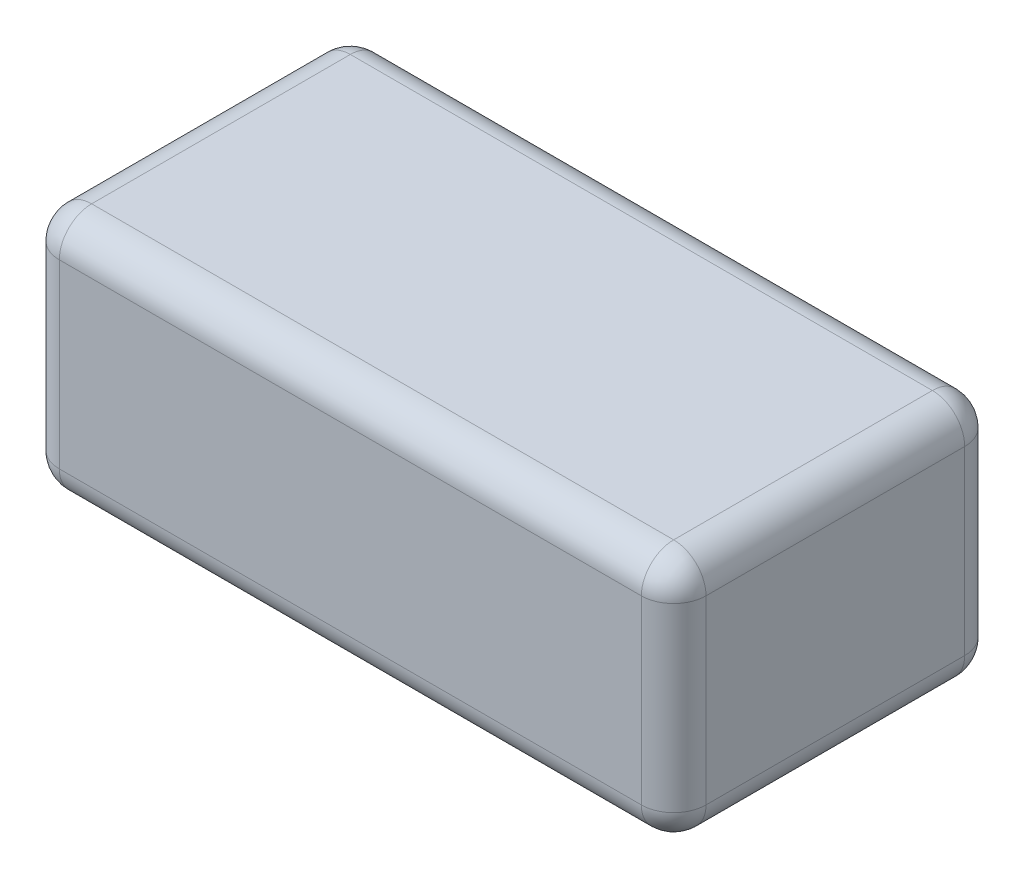
ISO-10303-21;
HEADER;
FILE_DESCRIPTION(('STEP AP214'),'2;1');
FILE_NAME('part.step','',(''),(''),'','','');
FILE_SCHEMA(('AUTOMOTIVE_DESIGN { 1 0 10303 214 1 1 1 1 }'));
ENDSEC;
DATA;
#1=APPLICATION_CONTEXT('core data for automotive mechanical design processes');
#2=APPLICATION_PROTOCOL_DEFINITION('international standard','automotive_design',2000,#1);
#3=PRODUCT_CONTEXT('',#1,'mechanical');
#4=PRODUCT('Part','Part','',(#3));
#5=PRODUCT_RELATED_PRODUCT_CATEGORY('part','',(#4));
#6=PRODUCT_DEFINITION_FORMATION('','',#4);
#7=PRODUCT_DEFINITION_CONTEXT('part definition',#1,'design');
#8=PRODUCT_DEFINITION('design','',#6,#7);
#9=PRODUCT_DEFINITION_SHAPE('','',#8);
#10=(LENGTH_UNIT() NAMED_UNIT(*) SI_UNIT(.MILLI.,.METRE.));
#11=(NAMED_UNIT(*) PLANE_ANGLE_UNIT() SI_UNIT($,.RADIAN.));
#12=(NAMED_UNIT(*) SI_UNIT($,.STERADIAN.) SOLID_ANGLE_UNIT());
#13=UNCERTAINTY_MEASURE_WITH_UNIT(LENGTH_MEASURE(1.E-05),#10,'distance_accuracy_value','');
#14=(GEOMETRIC_REPRESENTATION_CONTEXT(3) GLOBAL_UNCERTAINTY_ASSIGNED_CONTEXT((#13)) GLOBAL_UNIT_ASSIGNED_CONTEXT((#10,
#11,#12)) REPRESENTATION_CONTEXT('',''));
#15=CARTESIAN_POINT('',(0.,0.,0.));
#16=DIRECTION('',(0.,0.,1.));
#17=DIRECTION('',(1.,0.,0.));
#18=AXIS2_PLACEMENT_3D('',#15,#16,#17);
#19=CARTESIAN_POINT('',(0.45,0.05,0.2));
#20=DIRECTION('',(1.,0.,0.));
#21=DIRECTION('',(0.,0.,-1.));
#22=AXIS2_PLACEMENT_3D('',#19,#20,#21);
#23=SPHERICAL_SURFACE('',#22,0.05);
#24=CARTESIAN_POINT('',(0.45,0.05,0.2));
#25=DIRECTION('',(-1.,0.,0.));
#26=DIRECTION('',(0.,0.,1.));
#27=AXIS2_PLACEMENT_3D('',#24,#25,#26);
#28=CIRCLE('',#27,0.05);
#29=CARTESIAN_POINT('',(0.45,0.,0.2));
#30=VERTEX_POINT('',#29);
#31=CARTESIAN_POINT('',(0.45,0.050000000000024,0.25));
#32=VERTEX_POINT('',#31);
#33=EDGE_CURVE('E110',#30,#32,#28,.T.);
#34=ORIENTED_EDGE('',*,*,#33,.F.);
#35=CARTESIAN_POINT('',(0.45,0.05,0.2));
#36=DIRECTION('',(0.,0.,1.));
#37=DIRECTION('',(1.,0.,0.));
#38=AXIS2_PLACEMENT_3D('',#35,#36,#37);
#39=CIRCLE('',#38,0.05);
#40=CARTESIAN_POINT('',(0.5,0.05,0.2));
#41=VERTEX_POINT('',#40);
#42=EDGE_CURVE('E121',#41,#30,#39,.F.);
#43=ORIENTED_EDGE('',*,*,#42,.F.);
#44=CARTESIAN_POINT('',(0.45,0.05,0.2));
#45=DIRECTION('',(0.,-1.,0.));
#46=DIRECTION('',(0.,0.,-1.));
#47=AXIS2_PLACEMENT_3D('',#44,#45,#46);
#48=CIRCLE('',#47,0.05);
#49=EDGE_CURVE('E130',#32,#41,#48,.F.);
#50=ORIENTED_EDGE('',*,*,#49,.F.);
#51=EDGE_LOOP('',(#34,#43,#50));
#52=FACE_BOUND('',#51,.T.);
#53=ADVANCED_FACE('F16',(#52),#23,.T.);
#54=CARTESIAN_POINT('',(-0.45,0.05,0.2));
#55=DIRECTION('',(1.,0.,0.));
#56=DIRECTION('',(0.,0.,-1.));
#57=AXIS2_PLACEMENT_3D('',#54,#55,#56);
#58=SPHERICAL_SURFACE('',#57,0.05);
#59=CARTESIAN_POINT('',(-0.45,0.05,0.2));
#60=DIRECTION('',(0.,-1.,0.));
#61=DIRECTION('',(0.,0.,-1.));
#62=AXIS2_PLACEMENT_3D('',#59,#60,#61);
#63=CIRCLE('',#62,0.05);
#64=CARTESIAN_POINT('',(-0.5,0.05,0.2));
#65=VERTEX_POINT('',#64);
#66=CARTESIAN_POINT('',(-0.45,0.05,0.25));
#67=VERTEX_POINT('',#66);
#68=EDGE_CURVE('E260',#65,#67,#63,.F.);
#69=ORIENTED_EDGE('',*,*,#68,.F.);
#70=CARTESIAN_POINT('',(-0.45,0.05,0.2));
#71=DIRECTION('',(0.,0.,-1.));
#72=DIRECTION('',(-1.,0.,0.));
#73=AXIS2_PLACEMENT_3D('',#70,#71,#72);
#74=CIRCLE('',#73,0.05);
#75=CARTESIAN_POINT('',(-0.45,0.,0.199999999999976));
#76=VERTEX_POINT('',#75);
#77=EDGE_CURVE('E269',#76,#65,#74,.T.);
#78=ORIENTED_EDGE('',*,*,#77,.F.);
#79=CARTESIAN_POINT('',(-0.45,0.05,0.2));
#80=DIRECTION('',(-1.,0.,0.));
#81=DIRECTION('',(0.,0.,1.));
#82=AXIS2_PLACEMENT_3D('',#79,#80,#81);
#83=CIRCLE('',#82,0.05);
#84=EDGE_CURVE('E113',#67,#76,#83,.F.);
#85=ORIENTED_EDGE('',*,*,#84,.F.);
#86=EDGE_LOOP('',(#69,#78,#85));
#87=FACE_BOUND('',#86,.T.);
#88=ADVANCED_FACE('F150',(#87),#58,.T.);
#89=CARTESIAN_POINT('',(-0.45,0.05,-0.2));
#90=DIRECTION('',(1.,0.,0.));
#91=DIRECTION('',(0.,0.,-1.));
#92=AXIS2_PLACEMENT_3D('',#89,#90,#91);
#93=SPHERICAL_SURFACE('',#92,0.05);
#94=CARTESIAN_POINT('',(-0.45,0.05,-0.2));
#95=DIRECTION('',(0.,-1.,0.));
#96=DIRECTION('',(0.,0.,-1.));
#97=AXIS2_PLACEMENT_3D('',#94,#95,#96);
#98=CIRCLE('',#97,0.05);
#99=CARTESIAN_POINT('',(-0.45,0.05,-0.25));
#100=VERTEX_POINT('',#99);
#101=CARTESIAN_POINT('',(-0.5,0.05,-0.2));
#102=VERTEX_POINT('',#101);
#103=EDGE_CURVE('E255',#100,#102,#98,.F.);
#104=ORIENTED_EDGE('',*,*,#103,.F.);
#105=CARTESIAN_POINT('',(-0.45,0.05,-0.2));
#106=DIRECTION('',(1.,0.,0.));
#107=DIRECTION('',(0.,0.,-1.));
#108=AXIS2_PLACEMENT_3D('',#105,#106,#107);
#109=CIRCLE('',#108,0.05);
#110=CARTESIAN_POINT('',(-0.45,0.,-0.2));
#111=VERTEX_POINT('',#110);
#112=EDGE_CURVE('E252',#111,#100,#109,.T.);
#113=ORIENTED_EDGE('',*,*,#112,.F.);
#114=CARTESIAN_POINT('',(-0.45,0.05,-0.2));
#115=DIRECTION('',(0.,0.,-1.));
#116=DIRECTION('',(-1.,0.,0.));
#117=AXIS2_PLACEMENT_3D('',#114,#115,#116);
#118=CIRCLE('',#117,0.05);
#119=EDGE_CURVE('E266',#102,#111,#118,.F.);
#120=ORIENTED_EDGE('',*,*,#119,.F.);
#121=EDGE_LOOP('',(#104,#113,#120));
#122=FACE_BOUND('',#121,.T.);
#123=ADVANCED_FACE('F146',(#122),#93,.T.);
#124=CARTESIAN_POINT('',(0.45,0.05,-0.2));
#125=DIRECTION('',(1.,0.,0.));
#126=DIRECTION('',(0.,0.,-1.));
#127=AXIS2_PLACEMENT_3D('',#124,#125,#126);
#128=SPHERICAL_SURFACE('',#127,0.05);
#129=CARTESIAN_POINT('',(0.45,0.05,-0.2));
#130=DIRECTION('',(1.,0.,0.));
#131=DIRECTION('',(0.,0.,-1.));
#132=AXIS2_PLACEMENT_3D('',#129,#130,#131);
#133=CIRCLE('',#132,0.05);
#134=CARTESIAN_POINT('',(0.45,0.05,-0.25));
#135=VERTEX_POINT('',#134);
#136=CARTESIAN_POINT('',(0.45,0.,-0.199999999999988));
#137=VERTEX_POINT('',#136);
#138=EDGE_CURVE('E250',#135,#137,#133,.F.);
#139=ORIENTED_EDGE('',*,*,#138,.F.);
#140=CARTESIAN_POINT('',(0.45,0.05,-0.2));
#141=DIRECTION('',(0.,-1.,0.));
#142=DIRECTION('',(0.,0.,-1.));
#143=AXIS2_PLACEMENT_3D('',#140,#141,#142);
#144=CIRCLE('',#143,0.05);
#145=CARTESIAN_POINT('',(0.5,0.05,-0.2));
#146=VERTEX_POINT('',#145);
#147=EDGE_CURVE('E257',#146,#135,#144,.F.);
#148=ORIENTED_EDGE('',*,*,#147,.F.);
#149=CARTESIAN_POINT('',(0.45,0.05,-0.2));
#150=DIRECTION('',(0.,0.,1.));
#151=DIRECTION('',(1.,0.,0.));
#152=AXIS2_PLACEMENT_3D('',#149,#150,#151);
#153=CIRCLE('',#152,0.05);
#154=EDGE_CURVE('E132',#137,#146,#153,.T.);
#155=ORIENTED_EDGE('',*,*,#154,.F.);
#156=EDGE_LOOP('',(#139,#148,#155));
#157=FACE_BOUND('',#156,.T.);
#158=ADVANCED_FACE('F142',(#157),#128,.T.);
#159=CARTESIAN_POINT('',(0.45,0.05,0.25));
#160=DIRECTION('',(0.,0.,1.));
#161=DIRECTION('',(1.,0.,0.));
#162=AXIS2_PLACEMENT_3D('',#159,#160,#161);
#163=CYLINDRICAL_SURFACE('',#162,0.05);
#164=ORIENTED_EDGE('',*,*,#154,.T.);
#165=DIRECTION('',(0.,0.,1.));
#166=VECTOR('',#165,1.);
#167=CARTESIAN_POINT('',(0.5,0.05,0.25));
#168=LINE('',#167,#166);
#169=EDGE_CURVE('E126',#146,#41,#168,.T.);
#170=ORIENTED_EDGE('',*,*,#169,.T.);
#171=ORIENTED_EDGE('',*,*,#42,.T.);
#172=DIRECTION('',(0.,0.,1.));
#173=VECTOR('',#172,1.);
#174=CARTESIAN_POINT('',(0.45,0.,0.25));
#175=LINE('',#174,#173);
#176=EDGE_CURVE('E123',#30,#137,#175,.F.);
#177=ORIENTED_EDGE('',*,*,#176,.T.);
#178=EDGE_LOOP('',(#164,#170,#171,#177));
#179=FACE_BOUND('',#178,.T.);
#180=ADVANCED_FACE('F122',(#179),#163,.T.);
#181=CARTESIAN_POINT('',(0.45,0.38,0.2));
#182=DIRECTION('',(0.,-1.,0.));
#183=DIRECTION('',(0.,0.,-1.));
#184=AXIS2_PLACEMENT_3D('',#181,#182,#183);
#185=CYLINDRICAL_SURFACE('',#184,0.05);
#186=ORIENTED_EDGE('',*,*,#49,.T.);
#187=DIRECTION('',(0.,1.,0.));
#188=VECTOR('',#187,1.);
#189=CARTESIAN_POINT('',(0.5,0.38,0.2));
#190=LINE('',#189,#188);
#191=CARTESIAN_POINT('',(0.5,0.33,0.2));
#192=VERTEX_POINT('',#191);
#193=EDGE_CURVE('E246',#41,#192,#190,.T.);
#194=ORIENTED_EDGE('',*,*,#193,.T.);
#195=CARTESIAN_POINT('',(0.45,0.33,0.2));
#196=DIRECTION('',(0.,-1.,0.));
#197=DIRECTION('',(1.,0.,0.));
#198=AXIS2_PLACEMENT_3D('',#195,#196,#197);
#199=CIRCLE('',#198,0.05);
#200=CARTESIAN_POINT('',(0.45,0.33,0.25));
#201=VERTEX_POINT('',#200);
#202=EDGE_CURVE('E241',#201,#192,#199,.F.);
#203=ORIENTED_EDGE('',*,*,#202,.F.);
#204=DIRECTION('',(0.,1.,0.));
#205=VECTOR('',#204,1.);
#206=CARTESIAN_POINT('',(0.45,0.38,0.25));
#207=LINE('',#206,#205);
#208=EDGE_CURVE('E115',#201,#32,#207,.F.);
#209=ORIENTED_EDGE('',*,*,#208,.T.);
#210=EDGE_LOOP('',(#186,#194,#203,#209));
#211=FACE_BOUND('',#210,.T.);
#212=ADVANCED_FACE('F273',(#211),#185,.T.);
#213=CARTESIAN_POINT('',(-0.45,0.05,0.25));
#214=DIRECTION('',(0.,0.,-1.));
#215=DIRECTION('',(-1.,0.,0.));
#216=AXIS2_PLACEMENT_3D('',#213,#214,#215);
#217=CYLINDRICAL_SURFACE('',#216,0.05);
#218=ORIENTED_EDGE('',*,*,#119,.T.);
#219=DIRECTION('',(0.,0.,-1.));
#220=VECTOR('',#219,1.);
#221=CARTESIAN_POINT('',(-0.45,0.,0.25));
#222=LINE('',#221,#220);
#223=EDGE_CURVE('E263',#111,#76,#222,.F.);
#224=ORIENTED_EDGE('',*,*,#223,.T.);
#225=ORIENTED_EDGE('',*,*,#77,.T.);
#226=DIRECTION('',(0.,0.,-1.));
#227=VECTOR('',#226,1.);
#228=CARTESIAN_POINT('',(-0.5,0.05,0.25));
#229=LINE('',#228,#227);
#230=EDGE_CURVE('E219',#65,#102,#229,.T.);
#231=ORIENTED_EDGE('',*,*,#230,.T.);
#232=EDGE_LOOP('',(#218,#224,#225,#231));
#233=FACE_BOUND('',#232,.T.);
#234=ADVANCED_FACE('F360',(#233),#217,.T.);
#235=CARTESIAN_POINT('',(-0.45,0.38,0.2));
#236=DIRECTION('',(0.,-1.,0.));
#237=DIRECTION('',(0.,0.,-1.));
#238=AXIS2_PLACEMENT_3D('',#235,#236,#237);
#239=CYLINDRICAL_SURFACE('',#238,0.05);
#240=ORIENTED_EDGE('',*,*,#68,.T.);
#241=DIRECTION('',(0.,1.,0.));
#242=VECTOR('',#241,1.);
#243=CARTESIAN_POINT('',(-0.45,0.38,0.25));
#244=LINE('',#243,#242);
#245=CARTESIAN_POINT('',(-0.45,0.33,0.25));
#246=VERTEX_POINT('',#245);
#247=EDGE_CURVE('E240',#67,#246,#244,.T.);
#248=ORIENTED_EDGE('',*,*,#247,.T.);
#249=CARTESIAN_POINT('',(-0.45,0.33,0.2));
#250=DIRECTION('',(0.,-1.,0.));
#251=DIRECTION('',(1.,0.,0.));
#252=AXIS2_PLACEMENT_3D('',#249,#250,#251);
#253=CIRCLE('',#252,0.05);
#254=CARTESIAN_POINT('',(-0.5,0.33,0.2));
#255=VERTEX_POINT('',#254);
#256=EDGE_CURVE('E222',#255,#246,#253,.F.);
#257=ORIENTED_EDGE('',*,*,#256,.F.);
#258=DIRECTION('',(0.,1.,0.));
#259=VECTOR('',#258,1.);
#260=CARTESIAN_POINT('',(-0.5,0.38,0.2));
#261=LINE('',#260,#259);
#262=EDGE_CURVE('E213',#255,#65,#261,.F.);
#263=ORIENTED_EDGE('',*,*,#262,.T.);
#264=EDGE_LOOP('',(#240,#248,#257,#263));
#265=FACE_BOUND('',#264,.T.);
#266=ADVANCED_FACE('F358',(#265),#239,.T.);
#267=CARTESIAN_POINT('',(0.45,0.38,-0.2));
#268=DIRECTION('',(0.,-1.,0.));
#269=DIRECTION('',(0.,0.,-1.));
#270=AXIS2_PLACEMENT_3D('',#267,#268,#269);
#271=CYLINDRICAL_SURFACE('',#270,0.05);
#272=ORIENTED_EDGE('',*,*,#147,.T.);
#273=DIRECTION('',(0.,1.,0.));
#274=VECTOR('',#273,1.);
#275=CARTESIAN_POINT('',(0.45,0.38,-0.25));
#276=LINE('',#275,#274);
#277=CARTESIAN_POINT('',(0.45,0.33,-0.25));
#278=VERTEX_POINT('',#277);
#279=EDGE_CURVE('E205',#135,#278,#276,.T.);
#280=ORIENTED_EDGE('',*,*,#279,.T.);
#281=CARTESIAN_POINT('',(0.45,0.33,-0.2));
#282=DIRECTION('',(0.,1.,0.));
#283=DIRECTION('',(1.,0.,0.));
#284=AXIS2_PLACEMENT_3D('',#281,#282,#283);
#285=CIRCLE('',#284,0.05);
#286=CARTESIAN_POINT('',(0.5,0.33,-0.2));
#287=VERTEX_POINT('',#286);
#288=EDGE_CURVE('E207',#287,#278,#285,.T.);
#289=ORIENTED_EDGE('',*,*,#288,.F.);
#290=DIRECTION('',(0.,1.,0.));
#291=VECTOR('',#290,1.);
#292=CARTESIAN_POINT('',(0.5,0.38,-0.2));
#293=LINE('',#292,#291);
#294=EDGE_CURVE('E116',#287,#146,#293,.F.);
#295=ORIENTED_EDGE('',*,*,#294,.T.);
#296=EDGE_LOOP('',(#272,#280,#289,#295));
#297=FACE_BOUND('',#296,.T.);
#298=ADVANCED_FACE('F309',(#297),#271,.T.);
#299=CARTESIAN_POINT('',(-0.45,0.38,-0.2));
#300=DIRECTION('',(0.,-1.,0.));
#301=DIRECTION('',(0.,0.,-1.));
#302=AXIS2_PLACEMENT_3D('',#299,#300,#301);
#303=CYLINDRICAL_SURFACE('',#302,0.05);
#304=CARTESIAN_POINT('',(-0.45,0.33,-0.2));
#305=DIRECTION('',(0.,1.,0.));
#306=DIRECTION('',(1.,0.,0.));
#307=AXIS2_PLACEMENT_3D('',#304,#305,#306);
#308=CIRCLE('',#307,0.05);
#309=CARTESIAN_POINT('',(-0.45,0.33,-0.25));
#310=VERTEX_POINT('',#309);
#311=CARTESIAN_POINT('',(-0.5,0.33,-0.2));
#312=VERTEX_POINT('',#311);
#313=EDGE_CURVE('E209',#310,#312,#308,.T.);
#314=ORIENTED_EDGE('',*,*,#313,.F.);
#315=DIRECTION('',(0.,1.,0.));
#316=VECTOR('',#315,1.);
#317=CARTESIAN_POINT('',(-0.45,0.38,-0.25));
#318=LINE('',#317,#316);
#319=EDGE_CURVE('E299',#310,#100,#318,.F.);
#320=ORIENTED_EDGE('',*,*,#319,.T.);
#321=ORIENTED_EDGE('',*,*,#103,.T.);
#322=DIRECTION('',(0.,1.,0.));
#323=VECTOR('',#322,1.);
#324=CARTESIAN_POINT('',(-0.5,0.38,-0.2));
#325=LINE('',#324,#323);
#326=EDGE_CURVE('E216',#102,#312,#325,.T.);
#327=ORIENTED_EDGE('',*,*,#326,.T.);
#328=EDGE_LOOP('',(#314,#320,#321,#327));
#329=FACE_BOUND('',#328,.T.);
#330=ADVANCED_FACE('F350',(#329),#303,.T.);
#331=CARTESIAN_POINT('',(0.5,0.,-0.25));
#332=DIRECTION('',(0.,-1.,0.));
#333=DIRECTION('',(0.,0.,-1.));
#334=AXIS2_PLACEMENT_3D('',#331,#332,#333);
#335=PLANE('',#334);
#336=DIRECTION('',(1.,0.,0.));
#337=VECTOR('',#336,1.);
#338=CARTESIAN_POINT('',(-0.5,0.,-0.2));
#339=LINE('',#338,#337);
#340=EDGE_CURVE('E100',#137,#111,#339,.F.);
#341=ORIENTED_EDGE('',*,*,#340,.F.);
#342=ORIENTED_EDGE('',*,*,#176,.F.);
#343=DIRECTION('',(-1.,0.,0.));
#344=VECTOR('',#343,1.);
#345=CARTESIAN_POINT('',(-0.5,0.,0.2));
#346=LINE('',#345,#344);
#347=EDGE_CURVE('E106',#76,#30,#346,.F.);
#348=ORIENTED_EDGE('',*,*,#347,.F.);
#349=ORIENTED_EDGE('',*,*,#223,.F.);
#350=EDGE_LOOP('',(#341,#342,#348,#349));
#351=FACE_BOUND('',#350,.T.);
#352=ADVANCED_FACE('F134',(#351),#335,.T.);
#353=CARTESIAN_POINT('',(0.5,0.38,0.25));
#354=DIRECTION('',(-1.,0.,0.));
#355=DIRECTION('',(0.,0.,1.));
#356=AXIS2_PLACEMENT_3D('',#353,#354,#355);
#357=PLANE('',#356);
#358=DIRECTION('',(0.,0.,-1.));
#359=VECTOR('',#358,1.);
#360=CARTESIAN_POINT('',(0.5,0.33,-0.25));
#361=LINE('',#360,#359);
#362=EDGE_CURVE('E290',#192,#287,#361,.T.);
#363=ORIENTED_EDGE('',*,*,#362,.F.);
#364=ORIENTED_EDGE('',*,*,#193,.F.);
#365=ORIENTED_EDGE('',*,*,#169,.F.);
#366=ORIENTED_EDGE('',*,*,#294,.F.);
#367=EDGE_LOOP('',(#363,#364,#365,#366));
#368=FACE_BOUND('',#367,.T.);
#369=ADVANCED_FACE('F345',(#368),#357,.F.);
#370=CARTESIAN_POINT('',(-0.5,0.05,0.2));
#371=DIRECTION('',(-1.,0.,0.));
#372=DIRECTION('',(0.,0.,1.));
#373=AXIS2_PLACEMENT_3D('',#370,#371,#372);
#374=CYLINDRICAL_SURFACE('',#373,0.05);
#375=ORIENTED_EDGE('',*,*,#347,.T.);
#376=ORIENTED_EDGE('',*,*,#33,.T.);
#377=DIRECTION('',(-1.,0.,0.));
#378=VECTOR('',#377,1.);
#379=CARTESIAN_POINT('',(-0.5,0.05,0.25));
#380=LINE('',#379,#378);
#381=EDGE_CURVE('E281',#32,#67,#380,.T.);
#382=ORIENTED_EDGE('',*,*,#381,.T.);
#383=ORIENTED_EDGE('',*,*,#84,.T.);
#384=EDGE_LOOP('',(#375,#376,#382,#383));
#385=FACE_BOUND('',#384,.T.);
#386=ADVANCED_FACE('F108',(#385),#374,.T.);
#387=CARTESIAN_POINT('',(0.45,0.33,0.2));
#388=DIRECTION('',(1.,0.,0.));
#389=DIRECTION('',(0.,0.,-1.));
#390=AXIS2_PLACEMENT_3D('',#387,#388,#389);
#391=SPHERICAL_SURFACE('',#390,0.05);
#392=ORIENTED_EDGE('',*,*,#202,.T.);
#393=CARTESIAN_POINT('',(0.45,0.33,0.2));
#394=DIRECTION('',(0.,0.,-1.));
#395=DIRECTION('',(-1.,0.,0.));
#396=AXIS2_PLACEMENT_3D('',#393,#394,#395);
#397=CIRCLE('',#396,0.05);
#398=CARTESIAN_POINT('',(0.45,0.38,0.2));
#399=VERTEX_POINT('',#398);
#400=EDGE_CURVE('E296',#399,#192,#397,.T.);
#401=ORIENTED_EDGE('',*,*,#400,.F.);
#402=CARTESIAN_POINT('',(0.45,0.33,0.2));
#403=DIRECTION('',(1.,0.,0.));
#404=DIRECTION('',(0.,0.,-1.));
#405=AXIS2_PLACEMENT_3D('',#402,#403,#404);
#406=CIRCLE('',#405,0.05);
#407=EDGE_CURVE('E283',#201,#399,#406,.F.);
#408=ORIENTED_EDGE('',*,*,#407,.F.);
#409=EDGE_LOOP('',(#392,#401,#408));
#410=FACE_BOUND('',#409,.T.);
#411=ADVANCED_FACE('F231',(#410),#391,.T.);
#412=CARTESIAN_POINT('',(-0.45,0.33,0.2));
#413=DIRECTION('',(1.,0.,0.));
#414=DIRECTION('',(0.,0.,-1.));
#415=AXIS2_PLACEMENT_3D('',#412,#413,#414);
#416=SPHERICAL_SURFACE('',#415,0.05);
#417=ORIENTED_EDGE('',*,*,#256,.T.);
#418=CARTESIAN_POINT('',(-0.45,0.33,0.2));
#419=DIRECTION('',(1.,0.,0.));
#420=DIRECTION('',(0.,0.,-1.));
#421=AXIS2_PLACEMENT_3D('',#418,#419,#420);
#422=CIRCLE('',#421,0.05);
#423=CARTESIAN_POINT('',(-0.45,0.38,0.2));
#424=VERTEX_POINT('',#423);
#425=EDGE_CURVE('E287',#424,#246,#422,.T.);
#426=ORIENTED_EDGE('',*,*,#425,.F.);
#427=CARTESIAN_POINT('',(-0.45,0.33,0.2));
#428=DIRECTION('',(0.,0.,1.));
#429=DIRECTION('',(1.,0.,0.));
#430=AXIS2_PLACEMENT_3D('',#427,#428,#429);
#431=CIRCLE('',#430,0.05);
#432=EDGE_CURVE('E330',#255,#424,#431,.F.);
#433=ORIENTED_EDGE('',*,*,#432,.F.);
#434=EDGE_LOOP('',(#417,#426,#433));
#435=FACE_BOUND('',#434,.T.);
#436=ADVANCED_FACE('F227',(#435),#416,.T.);
#437=CARTESIAN_POINT('',(-0.5,0.38,0.25));
#438=DIRECTION('',(1.,0.,0.));
#439=DIRECTION('',(0.,0.,-1.));
#440=AXIS2_PLACEMENT_3D('',#437,#438,#439);
#441=PLANE('',#440);
#442=DIRECTION('',(0.,0.,1.));
#443=VECTOR('',#442,1.);
#444=CARTESIAN_POINT('',(-0.5,0.33,-0.25));
#445=LINE('',#444,#443);
#446=EDGE_CURVE('E321',#312,#255,#445,.T.);
#447=ORIENTED_EDGE('',*,*,#446,.F.);
#448=ORIENTED_EDGE('',*,*,#326,.F.);
#449=ORIENTED_EDGE('',*,*,#230,.F.);
#450=ORIENTED_EDGE('',*,*,#262,.F.);
#451=EDGE_LOOP('',(#447,#448,#449,#450));
#452=FACE_BOUND('',#451,.T.);
#453=ADVANCED_FACE('F230',(#452),#441,.F.);
#454=CARTESIAN_POINT('',(-0.45,0.33,-0.2));
#455=DIRECTION('',(1.,0.,0.));
#456=DIRECTION('',(0.,0.,-1.));
#457=AXIS2_PLACEMENT_3D('',#454,#455,#456);
#458=SPHERICAL_SURFACE('',#457,0.05);
#459=CARTESIAN_POINT('',(-0.45,0.33,-0.2));
#460=DIRECTION('',(0.,0.,1.));
#461=DIRECTION('',(1.,0.,0.));
#462=AXIS2_PLACEMENT_3D('',#459,#460,#461);
#463=CIRCLE('',#462,0.05);
#464=CARTESIAN_POINT('',(-0.45,0.38,-0.2));
#465=VERTEX_POINT('',#464);
#466=EDGE_CURVE('E327',#465,#312,#463,.T.);
#467=ORIENTED_EDGE('',*,*,#466,.F.);
#468=CARTESIAN_POINT('',(-0.45,0.33,-0.2));
#469=DIRECTION('',(-1.,0.,0.));
#470=DIRECTION('',(0.,0.,1.));
#471=AXIS2_PLACEMENT_3D('',#468,#469,#470);
#472=CIRCLE('',#471,0.05);
#473=EDGE_CURVE('E317',#310,#465,#472,.F.);
#474=ORIENTED_EDGE('',*,*,#473,.F.);
#475=ORIENTED_EDGE('',*,*,#313,.T.);
#476=EDGE_LOOP('',(#467,#474,#475));
#477=FACE_BOUND('',#476,.T.);
#478=ADVANCED_FACE('F198',(#477),#458,.T.);
#479=CARTESIAN_POINT('',(0.45,0.33,-0.2));
#480=DIRECTION('',(1.,0.,0.));
#481=DIRECTION('',(0.,0.,-1.));
#482=AXIS2_PLACEMENT_3D('',#479,#480,#481);
#483=SPHERICAL_SURFACE('',#482,0.05);
#484=CARTESIAN_POINT('',(0.45,0.33,-0.2));
#485=DIRECTION('',(0.,0.,-1.));
#486=DIRECTION('',(-1.,0.,0.));
#487=AXIS2_PLACEMENT_3D('',#484,#485,#486);
#488=CIRCLE('',#487,0.05);
#489=CARTESIAN_POINT('',(0.45,0.38,-0.2));
#490=VERTEX_POINT('',#489);
#491=EDGE_CURVE('E284',#287,#490,#488,.F.);
#492=ORIENTED_EDGE('',*,*,#491,.F.);
#493=ORIENTED_EDGE('',*,*,#288,.T.);
#494=CARTESIAN_POINT('',(0.45,0.33,-0.2));
#495=DIRECTION('',(-1.,0.,0.));
#496=DIRECTION('',(0.,0.,1.));
#497=AXIS2_PLACEMENT_3D('',#494,#495,#496);
#498=CIRCLE('',#497,0.05);
#499=EDGE_CURVE('E314',#490,#278,#498,.T.);
#500=ORIENTED_EDGE('',*,*,#499,.F.);
#501=EDGE_LOOP('',(#492,#493,#500));
#502=FACE_BOUND('',#501,.T.);
#503=ADVANCED_FACE('F193',(#502),#483,.T.);
#504=CARTESIAN_POINT('',(-0.5,0.05,-0.2));
#505=DIRECTION('',(1.,0.,0.));
#506=DIRECTION('',(0.,0.,-1.));
#507=AXIS2_PLACEMENT_3D('',#504,#505,#506);
#508=CYLINDRICAL_SURFACE('',#507,0.05);
#509=DIRECTION('',(1.,0.,0.));
#510=VECTOR('',#509,1.);
#511=CARTESIAN_POINT('',(-0.5,0.05,-0.25));
#512=LINE('',#511,#510);
#513=EDGE_CURVE('E316',#100,#135,#512,.T.);
#514=ORIENTED_EDGE('',*,*,#513,.T.);
#515=ORIENTED_EDGE('',*,*,#138,.T.);
#516=ORIENTED_EDGE('',*,*,#340,.T.);
#517=ORIENTED_EDGE('',*,*,#112,.T.);
#518=EDGE_LOOP('',(#514,#515,#516,#517));
#519=FACE_BOUND('',#518,.T.);
#520=ADVANCED_FACE('F189',(#519),#508,.T.);
#521=CARTESIAN_POINT('',(0.45,0.33,-0.25));
#522=DIRECTION('',(0.,0.,-1.));
#523=DIRECTION('',(-1.,0.,0.));
#524=AXIS2_PLACEMENT_3D('',#521,#522,#523);
#525=CYLINDRICAL_SURFACE('',#524,0.05);
#526=ORIENTED_EDGE('',*,*,#491,.T.);
#527=DIRECTION('',(0.,0.,-1.));
#528=VECTOR('',#527,1.);
#529=CARTESIAN_POINT('',(0.45,0.38,-0.25));
#530=LINE('',#529,#528);
#531=EDGE_CURVE('E319',#490,#399,#530,.F.);
#532=ORIENTED_EDGE('',*,*,#531,.T.);
#533=ORIENTED_EDGE('',*,*,#400,.T.);
#534=ORIENTED_EDGE('',*,*,#362,.T.);
#535=EDGE_LOOP('',(#526,#532,#533,#534));
#536=FACE_BOUND('',#535,.T.);
#537=ADVANCED_FACE('F185',(#536),#525,.T.);
#538=CARTESIAN_POINT('',(-0.5,0.38,0.25));
#539=DIRECTION('',(0.,0.,-1.));
#540=DIRECTION('',(-1.,0.,0.));
#541=AXIS2_PLACEMENT_3D('',#538,#539,#540);
#542=PLANE('',#541);
#543=DIRECTION('',(1.,0.,0.));
#544=VECTOR('',#543,1.);
#545=CARTESIAN_POINT('',(0.5,0.33,0.25));
#546=LINE('',#545,#544);
#547=EDGE_CURVE('E279',#246,#201,#546,.T.);
#548=ORIENTED_EDGE('',*,*,#547,.F.);
#549=ORIENTED_EDGE('',*,*,#247,.F.);
#550=ORIENTED_EDGE('',*,*,#381,.F.);
#551=ORIENTED_EDGE('',*,*,#208,.F.);
#552=EDGE_LOOP('',(#548,#549,#550,#551));
#553=FACE_BOUND('',#552,.T.);
#554=ADVANCED_FACE('F181',(#553),#542,.F.);
#555=CARTESIAN_POINT('',(-0.45,0.33,-0.25));
#556=DIRECTION('',(0.,0.,1.));
#557=DIRECTION('',(1.,0.,0.));
#558=AXIS2_PLACEMENT_3D('',#555,#556,#557);
#559=CYLINDRICAL_SURFACE('',#558,0.05);
#560=ORIENTED_EDGE('',*,*,#466,.T.);
#561=ORIENTED_EDGE('',*,*,#446,.T.);
#562=ORIENTED_EDGE('',*,*,#432,.T.);
#563=DIRECTION('',(0.,0.,-1.));
#564=VECTOR('',#563,1.);
#565=CARTESIAN_POINT('',(-0.45,0.38,-0.25));
#566=LINE('',#565,#564);
#567=EDGE_CURVE('E337',#424,#465,#566,.T.);
#568=ORIENTED_EDGE('',*,*,#567,.T.);
#569=EDGE_LOOP('',(#560,#561,#562,#568));
#570=FACE_BOUND('',#569,.T.);
#571=ADVANCED_FACE('F177',(#570),#559,.T.);
#572=CARTESIAN_POINT('',(-0.5,0.38,-0.25));
#573=DIRECTION('',(0.,0.,1.));
#574=DIRECTION('',(1.,0.,0.));
#575=AXIS2_PLACEMENT_3D('',#572,#573,#574);
#576=PLANE('',#575);
#577=ORIENTED_EDGE('',*,*,#513,.F.);
#578=ORIENTED_EDGE('',*,*,#319,.F.);
#579=DIRECTION('',(-1.,0.,0.));
#580=VECTOR('',#579,1.);
#581=CARTESIAN_POINT('',(0.5,0.33,-0.25));
#582=LINE('',#581,#580);
#583=EDGE_CURVE('E315',#278,#310,#582,.T.);
#584=ORIENTED_EDGE('',*,*,#583,.F.);
#585=ORIENTED_EDGE('',*,*,#279,.F.);
#586=EDGE_LOOP('',(#577,#578,#584,#585));
#587=FACE_BOUND('',#586,.T.);
#588=ADVANCED_FACE('F173',(#587),#576,.F.);
#589=CARTESIAN_POINT('',(0.5,0.33,0.2));
#590=DIRECTION('',(1.,0.,0.));
#591=DIRECTION('',(0.,0.,-1.));
#592=AXIS2_PLACEMENT_3D('',#589,#590,#591);
#593=CYLINDRICAL_SURFACE('',#592,0.05);
#594=ORIENTED_EDGE('',*,*,#547,.T.);
#595=ORIENTED_EDGE('',*,*,#407,.T.);
#596=DIRECTION('',(1.,0.,0.));
#597=VECTOR('',#596,1.);
#598=CARTESIAN_POINT('',(0.5,0.38,0.2));
#599=LINE('',#598,#597);
#600=EDGE_CURVE('E25',#399,#424,#599,.F.);
#601=ORIENTED_EDGE('',*,*,#600,.T.);
#602=ORIENTED_EDGE('',*,*,#425,.T.);
#603=EDGE_LOOP('',(#594,#595,#601,#602));
#604=FACE_BOUND('',#603,.T.);
#605=ADVANCED_FACE('F167',(#604),#593,.T.);
#606=CARTESIAN_POINT('',(0.5,0.33,-0.2));
#607=DIRECTION('',(-1.,0.,0.));
#608=DIRECTION('',(0.,0.,1.));
#609=AXIS2_PLACEMENT_3D('',#606,#607,#608);
#610=CYLINDRICAL_SURFACE('',#609,0.05);
#611=DIRECTION('',(1.,0.,0.));
#612=VECTOR('',#611,1.);
#613=CARTESIAN_POINT('',(0.5,0.38,-0.2));
#614=LINE('',#613,#612);
#615=EDGE_CURVE('E11',#465,#490,#614,.T.);
#616=ORIENTED_EDGE('',*,*,#615,.T.);
#617=ORIENTED_EDGE('',*,*,#499,.T.);
#618=ORIENTED_EDGE('',*,*,#583,.T.);
#619=ORIENTED_EDGE('',*,*,#473,.T.);
#620=EDGE_LOOP('',(#616,#617,#618,#619));
#621=FACE_BOUND('',#620,.T.);
#622=ADVANCED_FACE('F162',(#621),#610,.T.);
#623=CARTESIAN_POINT('',(0.5,0.38,-0.25));
#624=DIRECTION('',(0.,-1.,0.));
#625=DIRECTION('',(0.,0.,-1.));
#626=AXIS2_PLACEMENT_3D('',#623,#624,#625);
#627=PLANE('',#626);
#628=ORIENTED_EDGE('',*,*,#615,.F.);
#629=ORIENTED_EDGE('',*,*,#567,.F.);
#630=ORIENTED_EDGE('',*,*,#600,.F.);
#631=ORIENTED_EDGE('',*,*,#531,.F.);
#632=EDGE_LOOP('',(#628,#629,#630,#631));
#633=FACE_BOUND('',#632,.T.);
#634=ADVANCED_FACE('F160',(#633),#627,.F.);
#635=CLOSED_SHELL('',(#53,#88,#123,#158,#180,#212,#234,#266,#298,#330,#352,#369,#386,#411,#436,
#453,#478,#503,#520,#537,#554,#571,#588,#605,#622,#634));
#636=MANIFOLD_SOLID_BREP('B1',#635);
#637=ADVANCED_BREP_SHAPE_REPRESENTATION('',(#18,#636),#14);
#638=SHAPE_DEFINITION_REPRESENTATION(#9,#637);
ENDSEC;
END-ISO-10303-21;
